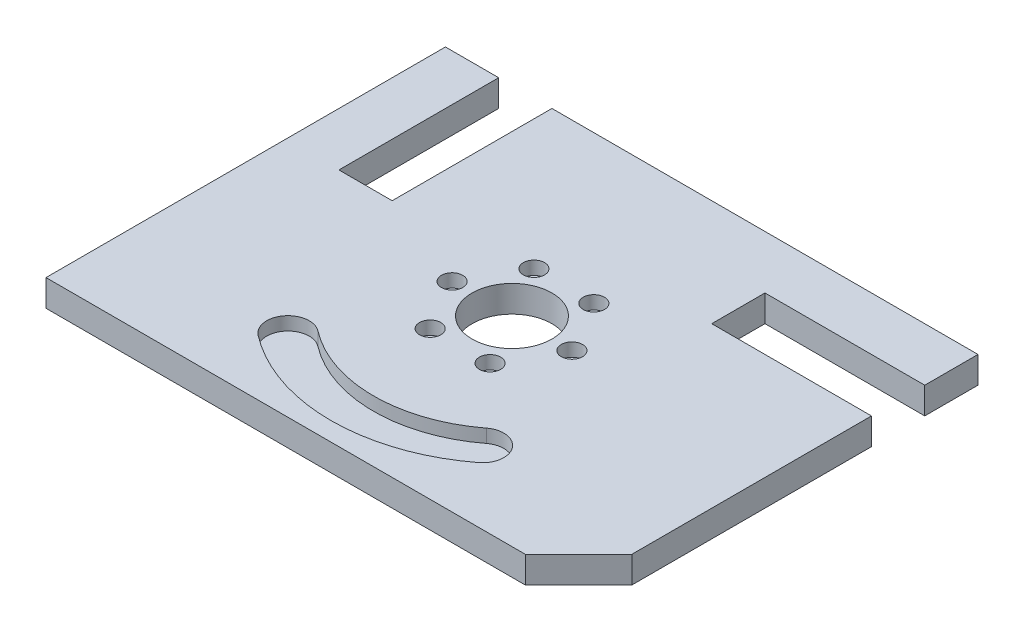
ISO-10303-21;
HEADER;
FILE_DESCRIPTION(('STEP AP214'),'2;1');
FILE_NAME('part.step','',(''),(''),'','','');
FILE_SCHEMA(('AUTOMOTIVE_DESIGN { 1 0 10303 214 1 1 1 1 }'));
ENDSEC;
DATA;
#1=APPLICATION_CONTEXT('core data for automotive mechanical design processes');
#2=APPLICATION_PROTOCOL_DEFINITION('international standard','automotive_design',2000,#1);
#3=PRODUCT_CONTEXT('',#1,'mechanical');
#4=PRODUCT('Part','Part','',(#3));
#5=PRODUCT_RELATED_PRODUCT_CATEGORY('part','',(#4));
#6=PRODUCT_DEFINITION_FORMATION('','',#4);
#7=PRODUCT_DEFINITION_CONTEXT('part definition',#1,'design');
#8=PRODUCT_DEFINITION('design','',#6,#7);
#9=PRODUCT_DEFINITION_SHAPE('','',#8);
#10=(LENGTH_UNIT() NAMED_UNIT(*) SI_UNIT(.MILLI.,.METRE.));
#11=(NAMED_UNIT(*) PLANE_ANGLE_UNIT() SI_UNIT($,.RADIAN.));
#12=(NAMED_UNIT(*) SI_UNIT($,.STERADIAN.) SOLID_ANGLE_UNIT());
#13=UNCERTAINTY_MEASURE_WITH_UNIT(LENGTH_MEASURE(1.E-05),#10,'distance_accuracy_value','');
#14=(GEOMETRIC_REPRESENTATION_CONTEXT(3) GLOBAL_UNCERTAINTY_ASSIGNED_CONTEXT((#13)) GLOBAL_UNIT_ASSIGNED_CONTEXT((#10,
#11,#12)) REPRESENTATION_CONTEXT('',''));
#15=CARTESIAN_POINT('',(0.,0.,0.));
#16=DIRECTION('',(0.,0.,1.));
#17=DIRECTION('',(1.,0.,0.));
#18=AXIS2_PLACEMENT_3D('',#15,#16,#17);
#19=CARTESIAN_POINT('',(100.,10.,-35.));
#20=DIRECTION('',(-1.,0.,0.));
#21=DIRECTION('',(0.,0.,1.));
#22=AXIS2_PLACEMENT_3D('',#19,#20,#21);
#23=PLANE('',#22);
#24=DIRECTION('',(0.,0.,-1.));
#25=VECTOR('',#24,1.);
#26=CARTESIAN_POINT('',(100.,10.,-35.));
#27=LINE('',#26,#25);
#28=CARTESIAN_POINT('',(100.,10.,55.));
#29=VERTEX_POINT('',#28);
#30=CARTESIAN_POINT('',(100.,10.,-35.));
#31=VERTEX_POINT('',#30);
#32=EDGE_CURVE('E266',#29,#31,#27,.T.);
#33=ORIENTED_EDGE('',*,*,#32,.F.);
#34=DIRECTION('',(0.,-1.,0.));
#35=VECTOR('',#34,1.);
#36=CARTESIAN_POINT('',(100.,10.,55.));
#37=LINE('',#36,#35);
#38=CARTESIAN_POINT('',(100.,0.,55.));
#39=VERTEX_POINT('',#38);
#40=EDGE_CURVE('E381',#29,#39,#37,.T.);
#41=ORIENTED_EDGE('',*,*,#40,.T.);
#42=DIRECTION('',(0.,0.,-1.));
#43=VECTOR('',#42,1.);
#44=CARTESIAN_POINT('',(100.,0.,-35.));
#45=LINE('',#44,#43);
#46=CARTESIAN_POINT('',(100.,0.,-35.));
#47=VERTEX_POINT('',#46);
#48=EDGE_CURVE('E262',#39,#47,#45,.T.);
#49=ORIENTED_EDGE('',*,*,#48,.T.);
#50=DIRECTION('',(0.,-1.,0.));
#51=VECTOR('',#50,1.);
#52=CARTESIAN_POINT('',(100.,10.,-35.));
#53=LINE('',#52,#51);
#54=EDGE_CURVE('E377',#31,#47,#53,.T.);
#55=ORIENTED_EDGE('',*,*,#54,.F.);
#56=EDGE_LOOP('',(#33,#41,#49,#55));
#57=FACE_BOUND('',#56,.T.);
#58=ADVANCED_FACE('F46',(#57),#23,.F.);
#59=CARTESIAN_POINT('',(40.,10.,-35.));
#60=DIRECTION('',(0.,0.,1.));
#61=DIRECTION('',(1.,0.,0.));
#62=AXIS2_PLACEMENT_3D('',#59,#60,#61);
#63=PLANE('',#62);
#64=DIRECTION('',(-1.,0.,0.));
#65=VECTOR('',#64,1.);
#66=CARTESIAN_POINT('',(40.,0.,-35.));
#67=LINE('',#66,#65);
#68=CARTESIAN_POINT('',(40.,0.,-35.));
#69=VERTEX_POINT('',#68);
#70=EDGE_CURVE('E306',#47,#69,#67,.T.);
#71=ORIENTED_EDGE('',*,*,#70,.T.);
#72=DIRECTION('',(0.,-1.,0.));
#73=VECTOR('',#72,1.);
#74=CARTESIAN_POINT('',(40.,10.,-35.));
#75=LINE('',#74,#73);
#76=CARTESIAN_POINT('',(40.,10.,-35.));
#77=VERTEX_POINT('',#76);
#78=EDGE_CURVE('E373',#77,#69,#75,.T.);
#79=ORIENTED_EDGE('',*,*,#78,.F.);
#80=DIRECTION('',(-1.,0.,0.));
#81=VECTOR('',#80,1.);
#82=CARTESIAN_POINT('',(40.,10.,-35.));
#83=LINE('',#82,#81);
#84=EDGE_CURVE('E269',#31,#77,#83,.T.);
#85=ORIENTED_EDGE('',*,*,#84,.F.);
#86=ORIENTED_EDGE('',*,*,#54,.T.);
#87=EDGE_LOOP('',(#71,#79,#85,#86));
#88=FACE_BOUND('',#87,.T.);
#89=ADVANCED_FACE('F428',(#88),#63,.F.);
#90=CARTESIAN_POINT('',(40.,10.,-55.));
#91=DIRECTION('',(-1.,0.,0.));
#92=DIRECTION('',(0.,0.,1.));
#93=AXIS2_PLACEMENT_3D('',#90,#91,#92);
#94=PLANE('',#93);
#95=DIRECTION('',(0.,0.,-1.));
#96=VECTOR('',#95,1.);
#97=CARTESIAN_POINT('',(40.,0.,-55.));
#98=LINE('',#97,#96);
#99=CARTESIAN_POINT('',(40.,0.,-55.));
#100=VERTEX_POINT('',#99);
#101=EDGE_CURVE('E309',#69,#100,#98,.T.);
#102=ORIENTED_EDGE('',*,*,#101,.T.);
#103=DIRECTION('',(0.,-1.,0.));
#104=VECTOR('',#103,1.);
#105=CARTESIAN_POINT('',(40.,10.,-55.));
#106=LINE('',#105,#104);
#107=CARTESIAN_POINT('',(40.,10.,-55.));
#108=VERTEX_POINT('',#107);
#109=EDGE_CURVE('E369',#108,#100,#106,.T.);
#110=ORIENTED_EDGE('',*,*,#109,.F.);
#111=DIRECTION('',(0.,0.,-1.));
#112=VECTOR('',#111,1.);
#113=CARTESIAN_POINT('',(40.,10.,-55.));
#114=LINE('',#113,#112);
#115=EDGE_CURVE('E273',#77,#108,#114,.T.);
#116=ORIENTED_EDGE('',*,*,#115,.F.);
#117=ORIENTED_EDGE('',*,*,#78,.T.);
#118=EDGE_LOOP('',(#102,#110,#116,#117));
#119=FACE_BOUND('',#118,.T.);
#120=ADVANCED_FACE('F434',(#119),#94,.F.);
#121=CARTESIAN_POINT('',(100.,10.,-55.));
#122=DIRECTION('',(0.,0.,-1.));
#123=DIRECTION('',(-1.,0.,0.));
#124=AXIS2_PLACEMENT_3D('',#121,#122,#123);
#125=PLANE('',#124);
#126=DIRECTION('',(1.,0.,0.));
#127=VECTOR('',#126,1.);
#128=CARTESIAN_POINT('',(100.,0.,-55.));
#129=LINE('',#128,#127);
#130=CARTESIAN_POINT('',(100.,0.,-55.));
#131=VERTEX_POINT('',#130);
#132=EDGE_CURVE('E312',#100,#131,#129,.T.);
#133=ORIENTED_EDGE('',*,*,#132,.T.);
#134=DIRECTION('',(0.,-1.,0.));
#135=VECTOR('',#134,1.);
#136=CARTESIAN_POINT('',(100.,10.,-55.));
#137=LINE('',#136,#135);
#138=CARTESIAN_POINT('',(100.,10.,-55.));
#139=VERTEX_POINT('',#138);
#140=EDGE_CURVE('E365',#139,#131,#137,.T.);
#141=ORIENTED_EDGE('',*,*,#140,.F.);
#142=DIRECTION('',(1.,0.,0.));
#143=VECTOR('',#142,1.);
#144=CARTESIAN_POINT('',(100.,10.,-55.));
#145=LINE('',#144,#143);
#146=EDGE_CURVE('E276',#108,#139,#145,.T.);
#147=ORIENTED_EDGE('',*,*,#146,.F.);
#148=ORIENTED_EDGE('',*,*,#109,.T.);
#149=EDGE_LOOP('',(#133,#141,#147,#148));
#150=FACE_BOUND('',#149,.T.);
#151=ADVANCED_FACE('F436',(#150),#125,.F.);
#152=CARTESIAN_POINT('',(100.,10.,-75.));
#153=DIRECTION('',(-1.,0.,0.));
#154=DIRECTION('',(0.,0.,1.));
#155=AXIS2_PLACEMENT_3D('',#152,#153,#154);
#156=PLANE('',#155);
#157=DIRECTION('',(0.,0.,-1.));
#158=VECTOR('',#157,1.);
#159=CARTESIAN_POINT('',(100.,0.,-75.));
#160=LINE('',#159,#158);
#161=CARTESIAN_POINT('',(100.,0.,-75.));
#162=VERTEX_POINT('',#161);
#163=EDGE_CURVE('E315',#131,#162,#160,.T.);
#164=ORIENTED_EDGE('',*,*,#163,.T.);
#165=DIRECTION('',(0.,-1.,0.));
#166=VECTOR('',#165,1.);
#167=CARTESIAN_POINT('',(100.,10.,-75.));
#168=LINE('',#167,#166);
#169=CARTESIAN_POINT('',(100.,10.,-75.));
#170=VERTEX_POINT('',#169);
#171=EDGE_CURVE('E361',#170,#162,#168,.T.);
#172=ORIENTED_EDGE('',*,*,#171,.F.);
#173=DIRECTION('',(0.,0.,-1.));
#174=VECTOR('',#173,1.);
#175=CARTESIAN_POINT('',(100.,10.,-75.));
#176=LINE('',#175,#174);
#177=EDGE_CURVE('E279',#139,#170,#176,.T.);
#178=ORIENTED_EDGE('',*,*,#177,.F.);
#179=ORIENTED_EDGE('',*,*,#140,.T.);
#180=EDGE_LOOP('',(#164,#172,#178,#179));
#181=FACE_BOUND('',#180,.T.);
#182=ADVANCED_FACE('F441',(#181),#156,.F.);
#183=CARTESIAN_POINT('',(-60.,10.,-75.));
#184=DIRECTION('',(0.,0.,1.));
#185=DIRECTION('',(1.,0.,0.));
#186=AXIS2_PLACEMENT_3D('',#183,#184,#185);
#187=PLANE('',#186);
#188=DIRECTION('',(-1.,0.,0.));
#189=VECTOR('',#188,1.);
#190=CARTESIAN_POINT('',(-60.,0.,-75.));
#191=LINE('',#190,#189);
#192=CARTESIAN_POINT('',(-60.,0.,-75.));
#193=VERTEX_POINT('',#192);
#194=EDGE_CURVE('E318',#162,#193,#191,.T.);
#195=ORIENTED_EDGE('',*,*,#194,.T.);
#196=DIRECTION('',(0.,-1.,0.));
#197=VECTOR('',#196,1.);
#198=CARTESIAN_POINT('',(-60.,10.,-75.));
#199=LINE('',#198,#197);
#200=CARTESIAN_POINT('',(-60.,10.,-75.));
#201=VERTEX_POINT('',#200);
#202=EDGE_CURVE('E357',#201,#193,#199,.T.);
#203=ORIENTED_EDGE('',*,*,#202,.F.);
#204=DIRECTION('',(-1.,0.,0.));
#205=VECTOR('',#204,1.);
#206=CARTESIAN_POINT('',(-60.,10.,-75.));
#207=LINE('',#206,#205);
#208=EDGE_CURVE('E282',#170,#201,#207,.T.);
#209=ORIENTED_EDGE('',*,*,#208,.F.);
#210=ORIENTED_EDGE('',*,*,#171,.T.);
#211=EDGE_LOOP('',(#195,#203,#209,#210));
#212=FACE_BOUND('',#211,.T.);
#213=ADVANCED_FACE('F447',(#212),#187,.F.);
#214=CARTESIAN_POINT('',(-60.,10.,-15.));
#215=DIRECTION('',(1.,0.,0.));
#216=DIRECTION('',(0.,0.,-1.));
#217=AXIS2_PLACEMENT_3D('',#214,#215,#216);
#218=PLANE('',#217);
#219=DIRECTION('',(0.,0.,1.));
#220=VECTOR('',#219,1.);
#221=CARTESIAN_POINT('',(-60.,0.,-15.));
#222=LINE('',#221,#220);
#223=CARTESIAN_POINT('',(-60.,0.,-15.));
#224=VERTEX_POINT('',#223);
#225=EDGE_CURVE('E321',#193,#224,#222,.T.);
#226=ORIENTED_EDGE('',*,*,#225,.T.);
#227=DIRECTION('',(0.,-1.,0.));
#228=VECTOR('',#227,1.);
#229=CARTESIAN_POINT('',(-60.,10.,-15.));
#230=LINE('',#229,#228);
#231=CARTESIAN_POINT('',(-60.,10.,-15.));
#232=VERTEX_POINT('',#231);
#233=EDGE_CURVE('E353',#232,#224,#230,.T.);
#234=ORIENTED_EDGE('',*,*,#233,.F.);
#235=DIRECTION('',(0.,0.,1.));
#236=VECTOR('',#235,1.);
#237=CARTESIAN_POINT('',(-60.,10.,-15.));
#238=LINE('',#237,#236);
#239=EDGE_CURVE('E285',#201,#232,#238,.T.);
#240=ORIENTED_EDGE('',*,*,#239,.F.);
#241=ORIENTED_EDGE('',*,*,#202,.T.);
#242=EDGE_LOOP('',(#226,#234,#240,#241));
#243=FACE_BOUND('',#242,.T.);
#244=ADVANCED_FACE('F451',(#243),#218,.F.);
#245=CARTESIAN_POINT('',(-80.,10.,-15.));
#246=DIRECTION('',(0.,0.,1.));
#247=DIRECTION('',(1.,0.,0.));
#248=AXIS2_PLACEMENT_3D('',#245,#246,#247);
#249=PLANE('',#248);
#250=DIRECTION('',(-1.,0.,0.));
#251=VECTOR('',#250,1.);
#252=CARTESIAN_POINT('',(-80.,0.,-15.));
#253=LINE('',#252,#251);
#254=CARTESIAN_POINT('',(-80.,0.,-15.));
#255=VERTEX_POINT('',#254);
#256=EDGE_CURVE('E324',#224,#255,#253,.T.);
#257=ORIENTED_EDGE('',*,*,#256,.T.);
#258=DIRECTION('',(0.,-1.,0.));
#259=VECTOR('',#258,1.);
#260=CARTESIAN_POINT('',(-80.,10.,-15.));
#261=LINE('',#260,#259);
#262=CARTESIAN_POINT('',(-80.,10.,-15.));
#263=VERTEX_POINT('',#262);
#264=EDGE_CURVE('E349',#263,#255,#261,.T.);
#265=ORIENTED_EDGE('',*,*,#264,.F.);
#266=DIRECTION('',(-1.,0.,0.));
#267=VECTOR('',#266,1.);
#268=CARTESIAN_POINT('',(-80.,10.,-15.));
#269=LINE('',#268,#267);
#270=EDGE_CURVE('E288',#232,#263,#269,.T.);
#271=ORIENTED_EDGE('',*,*,#270,.F.);
#272=ORIENTED_EDGE('',*,*,#233,.T.);
#273=EDGE_LOOP('',(#257,#265,#271,#272));
#274=FACE_BOUND('',#273,.T.);
#275=ADVANCED_FACE('F456',(#274),#249,.F.);
#276=CARTESIAN_POINT('',(-80.,10.,-75.));
#277=DIRECTION('',(-1.,0.,0.));
#278=DIRECTION('',(0.,0.,1.));
#279=AXIS2_PLACEMENT_3D('',#276,#277,#278);
#280=PLANE('',#279);
#281=DIRECTION('',(0.,0.,-1.));
#282=VECTOR('',#281,1.);
#283=CARTESIAN_POINT('',(-80.,0.,-75.));
#284=LINE('',#283,#282);
#285=CARTESIAN_POINT('',(-80.,0.,-75.));
#286=VERTEX_POINT('',#285);
#287=EDGE_CURVE('E327',#255,#286,#284,.T.);
#288=ORIENTED_EDGE('',*,*,#287,.T.);
#289=DIRECTION('',(0.,-1.,0.));
#290=VECTOR('',#289,1.);
#291=CARTESIAN_POINT('',(-80.,10.,-75.));
#292=LINE('',#291,#290);
#293=CARTESIAN_POINT('',(-80.,10.,-75.));
#294=VERTEX_POINT('',#293);
#295=EDGE_CURVE('E345',#294,#286,#292,.T.);
#296=ORIENTED_EDGE('',*,*,#295,.F.);
#297=DIRECTION('',(0.,0.,-1.));
#298=VECTOR('',#297,1.);
#299=CARTESIAN_POINT('',(-80.,10.,-75.));
#300=LINE('',#299,#298);
#301=EDGE_CURVE('E291',#263,#294,#300,.T.);
#302=ORIENTED_EDGE('',*,*,#301,.F.);
#303=ORIENTED_EDGE('',*,*,#264,.T.);
#304=EDGE_LOOP('',(#288,#296,#302,#303));
#305=FACE_BOUND('',#304,.T.);
#306=ADVANCED_FACE('F462',(#305),#280,.F.);
#307=CARTESIAN_POINT('',(-100.,10.,-75.));
#308=DIRECTION('',(0.,0.,1.));
#309=DIRECTION('',(1.,0.,0.));
#310=AXIS2_PLACEMENT_3D('',#307,#308,#309);
#311=PLANE('',#310);
#312=DIRECTION('',(-1.,0.,0.));
#313=VECTOR('',#312,1.);
#314=CARTESIAN_POINT('',(-100.,0.,-75.));
#315=LINE('',#314,#313);
#316=CARTESIAN_POINT('',(-100.,0.,-75.));
#317=VERTEX_POINT('',#316);
#318=EDGE_CURVE('E330',#286,#317,#315,.T.);
#319=ORIENTED_EDGE('',*,*,#318,.T.);
#320=DIRECTION('',(0.,-1.,0.));
#321=VECTOR('',#320,1.);
#322=CARTESIAN_POINT('',(-100.,10.,-75.));
#323=LINE('',#322,#321);
#324=CARTESIAN_POINT('',(-100.,10.,-75.));
#325=VERTEX_POINT('',#324);
#326=EDGE_CURVE('E341',#325,#317,#323,.T.);
#327=ORIENTED_EDGE('',*,*,#326,.F.);
#328=DIRECTION('',(-1.,0.,0.));
#329=VECTOR('',#328,1.);
#330=CARTESIAN_POINT('',(-100.,10.,-75.));
#331=LINE('',#330,#329);
#332=EDGE_CURVE('E294',#294,#325,#331,.T.);
#333=ORIENTED_EDGE('',*,*,#332,.F.);
#334=ORIENTED_EDGE('',*,*,#295,.T.);
#335=EDGE_LOOP('',(#319,#327,#333,#334));
#336=FACE_BOUND('',#335,.T.);
#337=ADVANCED_FACE('F466',(#336),#311,.F.);
#338=CARTESIAN_POINT('',(-100.,10.,-75.));
#339=DIRECTION('',(1.,0.,0.));
#340=DIRECTION('',(0.,0.,-1.));
#341=AXIS2_PLACEMENT_3D('',#338,#339,#340);
#342=PLANE('',#341);
#343=DIRECTION('',(0.,0.,1.));
#344=VECTOR('',#343,1.);
#345=CARTESIAN_POINT('',(-100.,0.,-75.));
#346=LINE('',#345,#344);
#347=CARTESIAN_POINT('',(-100.,0.,75.));
#348=VERTEX_POINT('',#347);
#349=EDGE_CURVE('E333',#317,#348,#346,.T.);
#350=ORIENTED_EDGE('',*,*,#349,.T.);
#351=DIRECTION('',(0.,-1.,0.));
#352=VECTOR('',#351,1.);
#353=CARTESIAN_POINT('',(-100.,10.,75.));
#354=LINE('',#353,#352);
#355=CARTESIAN_POINT('',(-100.,10.,75.));
#356=VERTEX_POINT('',#355);
#357=EDGE_CURVE('E303',#356,#348,#354,.T.);
#358=ORIENTED_EDGE('',*,*,#357,.F.);
#359=DIRECTION('',(0.,0.,1.));
#360=VECTOR('',#359,1.);
#361=CARTESIAN_POINT('',(-100.,10.,-75.));
#362=LINE('',#361,#360);
#363=EDGE_CURVE('E297',#325,#356,#362,.T.);
#364=ORIENTED_EDGE('',*,*,#363,.F.);
#365=ORIENTED_EDGE('',*,*,#326,.T.);
#366=EDGE_LOOP('',(#350,#358,#364,#365));
#367=FACE_BOUND('',#366,.T.);
#368=ADVANCED_FACE('F469',(#367),#342,.F.);
#369=CARTESIAN_POINT('',(-100.,10.,75.));
#370=DIRECTION('',(0.,0.,-1.));
#371=DIRECTION('',(-1.,0.,0.));
#372=AXIS2_PLACEMENT_3D('',#369,#370,#371);
#373=PLANE('',#372);
#374=DIRECTION('',(1.,0.,0.));
#375=VECTOR('',#374,1.);
#376=CARTESIAN_POINT('',(-100.,0.,75.));
#377=LINE('',#376,#375);
#378=CARTESIAN_POINT('',(79.9999999999999,0.,75.));
#379=VERTEX_POINT('',#378);
#380=EDGE_CURVE('E270',#348,#379,#377,.T.);
#381=ORIENTED_EDGE('',*,*,#380,.T.);
#382=DIRECTION('',(0.,1.,0.));
#383=VECTOR('',#382,1.);
#384=CARTESIAN_POINT('',(79.9999999999999,10.,75.));
#385=LINE('',#384,#383);
#386=CARTESIAN_POINT('',(79.9999999999999,10.,75.));
#387=VERTEX_POINT('',#386);
#388=EDGE_CURVE('E56',#379,#387,#385,.T.);
#389=ORIENTED_EDGE('',*,*,#388,.T.);
#390=DIRECTION('',(1.,0.,0.));
#391=VECTOR('',#390,1.);
#392=CARTESIAN_POINT('',(-100.,10.,75.));
#393=LINE('',#392,#391);
#394=EDGE_CURVE('E300',#356,#387,#393,.T.);
#395=ORIENTED_EDGE('',*,*,#394,.F.);
#396=ORIENTED_EDGE('',*,*,#357,.T.);
#397=EDGE_LOOP('',(#381,#389,#395,#396));
#398=FACE_BOUND('',#397,.T.);
#399=ADVANCED_FACE('F407',(#398),#373,.F.);
#400=CARTESIAN_POINT('',(0.,10.,0.));
#401=DIRECTION('',(0.,1.,0.));
#402=DIRECTION('',(0.,0.,1.));
#403=AXIS2_PLACEMENT_3D('',#400,#401,#402);
#404=PLANE('',#403);
#405=CARTESIAN_POINT('',(22.5,10.,0.));
#406=DIRECTION('',(0.,1.,0.));
#407=DIRECTION('',(0.,0.,1.));
#408=AXIS2_PLACEMENT_3D('',#405,#406,#407);
#409=CIRCLE('',#408,4.);
#410=CARTESIAN_POINT('',(22.5,10.,4.));
#411=VERTEX_POINT('',#410);
#412=EDGE_CURVE('E229',#411,#411,#409,.T.);
#413=ORIENTED_EDGE('',*,*,#412,.F.);
#414=EDGE_LOOP('',(#413));
#415=FACE_BOUND('',#414,.T.);
#416=CARTESIAN_POINT('',(11.25,10.,19.4855715851499));
#417=DIRECTION('',(0.,1.,0.));
#418=DIRECTION('',(0.,0.,1.));
#419=AXIS2_PLACEMENT_3D('',#416,#417,#418);
#420=CIRCLE('',#419,4.);
#421=CARTESIAN_POINT('',(11.25,10.,23.4855715851499));
#422=VERTEX_POINT('',#421);
#423=EDGE_CURVE('E237',#422,#422,#420,.T.);
#424=ORIENTED_EDGE('',*,*,#423,.F.);
#425=EDGE_LOOP('',(#424));
#426=FACE_BOUND('',#425,.T.);
#427=CARTESIAN_POINT('',(-11.2500000000001,10.,19.4855715851498));
#428=DIRECTION('',(0.,1.,0.));
#429=DIRECTION('',(0.,0.,1.));
#430=AXIS2_PLACEMENT_3D('',#427,#428,#429);
#431=CIRCLE('',#430,4.);
#432=CARTESIAN_POINT('',(-11.2500000000001,10.,23.4855715851498));
#433=VERTEX_POINT('',#432);
#434=EDGE_CURVE('E245',#433,#433,#431,.T.);
#435=ORIENTED_EDGE('',*,*,#434,.F.);
#436=EDGE_LOOP('',(#435));
#437=FACE_BOUND('',#436,.T.);
#438=CARTESIAN_POINT('',(-22.5,10.,-1.57116660247941E-13));
#439=DIRECTION('',(0.,1.,0.));
#440=DIRECTION('',(0.,0.,1.));
#441=AXIS2_PLACEMENT_3D('',#438,#439,#440);
#442=CIRCLE('',#441,4.);
#443=CARTESIAN_POINT('',(-22.5,10.,3.99999999999984));
#444=VERTEX_POINT('',#443);
#445=EDGE_CURVE('E253',#444,#444,#442,.T.);
#446=ORIENTED_EDGE('',*,*,#445,.F.);
#447=EDGE_LOOP('',(#446));
#448=FACE_BOUND('',#447,.T.);
#449=CARTESIAN_POINT('',(-11.2499999999998,10.,-19.48557158515));
#450=DIRECTION('',(0.,1.,0.));
#451=DIRECTION('',(0.,0.,1.));
#452=AXIS2_PLACEMENT_3D('',#449,#450,#451);
#453=CIRCLE('',#452,4.);
#454=CARTESIAN_POINT('',(-11.2499999999998,10.,-15.48557158515));
#455=VERTEX_POINT('',#454);
#456=EDGE_CURVE('E390',#455,#455,#453,.T.);
#457=ORIENTED_EDGE('',*,*,#456,.F.);
#458=EDGE_LOOP('',(#457));
#459=FACE_BOUND('',#458,.T.);
#460=CARTESIAN_POINT('',(11.2500000000002,10.,-19.4855715851497));
#461=DIRECTION('',(0.,1.,0.));
#462=DIRECTION('',(0.,0.,1.));
#463=AXIS2_PLACEMENT_3D('',#460,#461,#462);
#464=CIRCLE('',#463,4.);
#465=CARTESIAN_POINT('',(11.2500000000002,10.,-15.4855715851497));
#466=VERTEX_POINT('',#465);
#467=EDGE_CURVE('E201',#466,#466,#464,.T.);
#468=ORIENTED_EDGE('',*,*,#467,.F.);
#469=EDGE_LOOP('',(#468));
#470=FACE_BOUND('',#469,.T.);
#471=CARTESIAN_POINT('',(-36.5212503673279,10.,47.6046034707459));
#472=DIRECTION('',(0.,1.,0.));
#473=DIRECTION('',(0.,0.,1.));
#474=AXIS2_PLACEMENT_3D('',#471,#472,#473);
#475=CIRCLE('',#474,8.);
#476=CARTESIAN_POINT('',(-31.6517503183508,10.,41.2573230079798));
#477=VERTEX_POINT('',#476);
#478=CARTESIAN_POINT('',(-41.390750416305,10.,53.951883933512));
#479=VERTEX_POINT('',#478);
#480=EDGE_CURVE('E174',#477,#479,#475,.T.);
#481=ORIENTED_EDGE('',*,*,#480,.F.);
#482=CARTESIAN_POINT('',(0.,10.,0.));
#483=DIRECTION('',(0.,-1.,0.));
#484=DIRECTION('',(0.,0.,1.));
#485=AXIS2_PLACEMENT_3D('',#482,#483,#484);
#486=CIRCLE('',#485,52.);
#487=CARTESIAN_POINT('',(31.6517503183508,10.,41.2573230079798));
#488=VERTEX_POINT('',#487);
#489=EDGE_CURVE('E194',#488,#477,#486,.T.);
#490=ORIENTED_EDGE('',*,*,#489,.F.);
#491=CARTESIAN_POINT('',(36.5212503673279,10.,47.6046034707459));
#492=DIRECTION('',(0.,1.,0.));
#493=DIRECTION('',(0.,0.,1.));
#494=AXIS2_PLACEMENT_3D('',#491,#492,#493);
#495=CIRCLE('',#494,8.);
#496=CARTESIAN_POINT('',(41.390750416305,10.,53.951883933512));
#497=VERTEX_POINT('',#496);
#498=EDGE_CURVE('E198',#497,#488,#495,.T.);
#499=ORIENTED_EDGE('',*,*,#498,.F.);
#500=CARTESIAN_POINT('',(0.,10.,0.));
#501=DIRECTION('',(0.,1.,0.));
#502=DIRECTION('',(0.,0.,1.));
#503=AXIS2_PLACEMENT_3D('',#500,#501,#502);
#504=CIRCLE('',#503,68.);
#505=EDGE_CURVE('E210',#479,#497,#504,.T.);
#506=ORIENTED_EDGE('',*,*,#505,.F.);
#507=EDGE_LOOP('',(#481,#490,#499,#506));
#508=FACE_BOUND('',#507,.T.);
#509=CARTESIAN_POINT('',(0.,10.,0.));
#510=DIRECTION('',(0.,1.,0.));
#511=DIRECTION('',(0.,0.,1.));
#512=AXIS2_PLACEMENT_3D('',#509,#510,#511);
#513=CIRCLE('',#512,15.);
#514=CARTESIAN_POINT('',(0.,10.,15.));
#515=VERTEX_POINT('',#514);
#516=EDGE_CURVE('E228',#515,#515,#513,.T.);
#517=ORIENTED_EDGE('',*,*,#516,.F.);
#518=EDGE_LOOP('',(#517));
#519=FACE_BOUND('',#518,.T.);
#520=ORIENTED_EDGE('',*,*,#394,.T.);
#521=DIRECTION('',(-0.707106781186549,0.,0.707106781186546));
#522=VECTOR('',#521,1.);
#523=CARTESIAN_POINT('',(77.4999999999998,10.,77.5000000000001));
#524=LINE('',#523,#522);
#525=EDGE_CURVE('E11',#387,#29,#524,.F.);
#526=ORIENTED_EDGE('',*,*,#525,.T.);
#527=ORIENTED_EDGE('',*,*,#32,.T.);
#528=ORIENTED_EDGE('',*,*,#84,.T.);
#529=ORIENTED_EDGE('',*,*,#115,.T.);
#530=ORIENTED_EDGE('',*,*,#146,.T.);
#531=ORIENTED_EDGE('',*,*,#177,.T.);
#532=ORIENTED_EDGE('',*,*,#208,.T.);
#533=ORIENTED_EDGE('',*,*,#239,.T.);
#534=ORIENTED_EDGE('',*,*,#270,.T.);
#535=ORIENTED_EDGE('',*,*,#301,.T.);
#536=ORIENTED_EDGE('',*,*,#332,.T.);
#537=ORIENTED_EDGE('',*,*,#363,.T.);
#538=EDGE_LOOP('',(#520,#526,#527,#528,#529,#530,#531,#532,#533,#534,#535,#536,#537));
#539=FACE_BOUND('',#538,.T.);
#540=ADVANCED_FACE('F403',(#415,#426,#437,#448,#459,#470,#508,#519,#539),#404,.T.);
#541=CARTESIAN_POINT('',(0.,0.,0.));
#542=DIRECTION('',(0.,1.,0.));
#543=DIRECTION('',(0.,0.,1.));
#544=AXIS2_PLACEMENT_3D('',#541,#542,#543);
#545=PLANE('',#544);
#546=CARTESIAN_POINT('',(0.,0.,0.));
#547=DIRECTION('',(0.,1.,0.));
#548=DIRECTION('',(0.,0.,1.));
#549=AXIS2_PLACEMENT_3D('',#546,#547,#548);
#550=CIRCLE('',#549,15.);
#551=CARTESIAN_POINT('',(0.,0.,15.));
#552=VERTEX_POINT('',#551);
#553=EDGE_CURVE('E258',#552,#552,#550,.T.);
#554=ORIENTED_EDGE('',*,*,#553,.T.);
#555=EDGE_LOOP('',(#554));
#556=FACE_BOUND('',#555,.T.);
#557=ORIENTED_EDGE('',*,*,#48,.F.);
#558=DIRECTION('',(0.707106781186549,0.,-0.707106781186546));
#559=VECTOR('',#558,1.);
#560=CARTESIAN_POINT('',(100.,0.,55.));
#561=LINE('',#560,#559);
#562=EDGE_CURVE('E70',#39,#379,#561,.F.);
#563=ORIENTED_EDGE('',*,*,#562,.T.);
#564=ORIENTED_EDGE('',*,*,#380,.F.);
#565=ORIENTED_EDGE('',*,*,#349,.F.);
#566=ORIENTED_EDGE('',*,*,#318,.F.);
#567=ORIENTED_EDGE('',*,*,#287,.F.);
#568=ORIENTED_EDGE('',*,*,#256,.F.);
#569=ORIENTED_EDGE('',*,*,#225,.F.);
#570=ORIENTED_EDGE('',*,*,#194,.F.);
#571=ORIENTED_EDGE('',*,*,#163,.F.);
#572=ORIENTED_EDGE('',*,*,#132,.F.);
#573=ORIENTED_EDGE('',*,*,#101,.F.);
#574=ORIENTED_EDGE('',*,*,#70,.F.);
#575=EDGE_LOOP('',(#557,#563,#564,#565,#566,#567,#568,#569,#570,#571,#572,#573,#574));
#576=FACE_BOUND('',#575,.T.);
#577=ADVANCED_FACE('F406',(#556,#576),#545,.F.);
#578=CARTESIAN_POINT('',(0.,0.,0.));
#579=DIRECTION('',(0.,1.,0.));
#580=DIRECTION('',(0.,0.,1.));
#581=AXIS2_PLACEMENT_3D('',#578,#579,#580);
#582=CYLINDRICAL_SURFACE('',#581,15.);
#583=ORIENTED_EDGE('',*,*,#516,.T.);
#584=EDGE_LOOP('',(#583));
#585=FACE_BOUND('',#584,.T.);
#586=ORIENTED_EDGE('',*,*,#553,.F.);
#587=EDGE_LOOP('',(#586));
#588=FACE_BOUND('',#587,.T.);
#589=ADVANCED_FACE('F598',(#585,#588),#582,.F.);
#590=CARTESIAN_POINT('',(-36.5212503673279,5.,47.6046034707459));
#591=DIRECTION('',(0.,1.,0.));
#592=DIRECTION('',(0.,0.,1.));
#593=AXIS2_PLACEMENT_3D('',#590,#591,#592);
#594=CYLINDRICAL_SURFACE('',#593,8.);
#595=ORIENTED_EDGE('',*,*,#480,.T.);
#596=DIRECTION('',(0.,1.,0.));
#597=VECTOR('',#596,1.);
#598=CARTESIAN_POINT('',(-41.390750416305,5.,53.951883933512));
#599=LINE('',#598,#597);
#600=CARTESIAN_POINT('',(-41.390750416305,5.,53.951883933512));
#601=VERTEX_POINT('',#600);
#602=EDGE_CURVE('E167',#601,#479,#599,.T.);
#603=ORIENTED_EDGE('',*,*,#602,.F.);
#604=CARTESIAN_POINT('',(-36.5212503673279,5.,47.6046034707459));
#605=DIRECTION('',(0.,1.,0.));
#606=DIRECTION('',(0.,0.,1.));
#607=AXIS2_PLACEMENT_3D('',#604,#605,#606);
#608=CIRCLE('',#607,8.);
#609=CARTESIAN_POINT('',(-31.6517503183508,5.,41.2573230079798));
#610=VERTEX_POINT('',#609);
#611=EDGE_CURVE('E171',#610,#601,#608,.T.);
#612=ORIENTED_EDGE('',*,*,#611,.F.);
#613=DIRECTION('',(0.,1.,0.));
#614=VECTOR('',#613,1.);
#615=CARTESIAN_POINT('',(-31.6517503183508,5.,41.2573230079798));
#616=LINE('',#615,#614);
#617=EDGE_CURVE('E216',#610,#477,#616,.T.);
#618=ORIENTED_EDGE('',*,*,#617,.T.);
#619=EDGE_LOOP('',(#595,#603,#612,#618));
#620=FACE_BOUND('',#619,.T.);
#621=ADVANCED_FACE('F169',(#620),#594,.F.);
#622=CARTESIAN_POINT('',(0.,5.,0.));
#623=DIRECTION('',(0.,1.,0.));
#624=DIRECTION('',(0.,0.,1.));
#625=AXIS2_PLACEMENT_3D('',#622,#623,#624);
#626=CYLINDRICAL_SURFACE('',#625,52.);
#627=ORIENTED_EDGE('',*,*,#489,.T.);
#628=ORIENTED_EDGE('',*,*,#617,.F.);
#629=CARTESIAN_POINT('',(0.,5.,0.));
#630=DIRECTION('',(0.,-1.,0.));
#631=DIRECTION('',(0.,0.,1.));
#632=AXIS2_PLACEMENT_3D('',#629,#630,#631);
#633=CIRCLE('',#632,52.);
#634=CARTESIAN_POINT('',(31.6517503183508,5.,41.2573230079798));
#635=VERTEX_POINT('',#634);
#636=EDGE_CURVE('E180',#635,#610,#633,.T.);
#637=ORIENTED_EDGE('',*,*,#636,.F.);
#638=DIRECTION('',(0.,1.,0.));
#639=VECTOR('',#638,1.);
#640=CARTESIAN_POINT('',(31.6517503183508,5.,41.2573230079798));
#641=LINE('',#640,#639);
#642=EDGE_CURVE('E219',#635,#488,#641,.T.);
#643=ORIENTED_EDGE('',*,*,#642,.T.);
#644=EDGE_LOOP('',(#627,#628,#637,#643));
#645=FACE_BOUND('',#644,.T.);
#646=ADVANCED_FACE('F620',(#645),#626,.T.);
#647=CARTESIAN_POINT('',(36.5212503673279,5.,47.6046034707459));
#648=DIRECTION('',(0.,1.,0.));
#649=DIRECTION('',(0.,0.,1.));
#650=AXIS2_PLACEMENT_3D('',#647,#648,#649);
#651=CYLINDRICAL_SURFACE('',#650,8.);
#652=ORIENTED_EDGE('',*,*,#498,.T.);
#653=ORIENTED_EDGE('',*,*,#642,.F.);
#654=CARTESIAN_POINT('',(36.5212503673279,5.,47.6046034707459));
#655=DIRECTION('',(0.,1.,0.));
#656=DIRECTION('',(0.,0.,1.));
#657=AXIS2_PLACEMENT_3D('',#654,#655,#656);
#658=CIRCLE('',#657,8.);
#659=CARTESIAN_POINT('',(41.390750416305,5.,53.951883933512));
#660=VERTEX_POINT('',#659);
#661=EDGE_CURVE('E189',#660,#635,#658,.T.);
#662=ORIENTED_EDGE('',*,*,#661,.F.);
#663=DIRECTION('',(0.,1.,0.));
#664=VECTOR('',#663,1.);
#665=CARTESIAN_POINT('',(41.390750416305,5.,53.951883933512));
#666=LINE('',#665,#664);
#667=EDGE_CURVE('E179',#660,#497,#666,.T.);
#668=ORIENTED_EDGE('',*,*,#667,.T.);
#669=EDGE_LOOP('',(#652,#653,#662,#668));
#670=FACE_BOUND('',#669,.T.);
#671=ADVANCED_FACE('F631',(#670),#651,.F.);
#672=CARTESIAN_POINT('',(0.,5.,0.));
#673=DIRECTION('',(0.,1.,0.));
#674=DIRECTION('',(0.,0.,1.));
#675=AXIS2_PLACEMENT_3D('',#672,#673,#674);
#676=CYLINDRICAL_SURFACE('',#675,68.);
#677=ORIENTED_EDGE('',*,*,#505,.T.);
#678=ORIENTED_EDGE('',*,*,#667,.F.);
#679=CARTESIAN_POINT('',(0.,5.,0.));
#680=DIRECTION('',(0.,1.,0.));
#681=DIRECTION('',(0.,0.,1.));
#682=AXIS2_PLACEMENT_3D('',#679,#680,#681);
#683=CIRCLE('',#682,68.);
#684=EDGE_CURVE('E183',#601,#660,#683,.T.);
#685=ORIENTED_EDGE('',*,*,#684,.F.);
#686=ORIENTED_EDGE('',*,*,#602,.T.);
#687=EDGE_LOOP('',(#677,#678,#685,#686));
#688=FACE_BOUND('',#687,.T.);
#689=ADVANCED_FACE('F184',(#688),#676,.F.);
#690=CARTESIAN_POINT('',(-18.2606251836639,5.,23.8023017353729));
#691=DIRECTION('',(0.,1.,0.));
#692=DIRECTION('',(0.,0.,1.));
#693=AXIS2_PLACEMENT_3D('',#690,#691,#692);
#694=PLANE('',#693);
#695=ORIENTED_EDGE('',*,*,#611,.T.);
#696=ORIENTED_EDGE('',*,*,#684,.T.);
#697=ORIENTED_EDGE('',*,*,#661,.T.);
#698=ORIENTED_EDGE('',*,*,#636,.T.);
#699=EDGE_LOOP('',(#695,#696,#697,#698));
#700=FACE_BOUND('',#699,.T.);
#701=ADVANCED_FACE('F191',(#700),#694,.T.);
#702=CARTESIAN_POINT('',(11.2500000000002,5.,-19.4855715851497));
#703=DIRECTION('',(0.,1.,0.));
#704=DIRECTION('',(0.,0.,1.));
#705=AXIS2_PLACEMENT_3D('',#702,#703,#704);
#706=CYLINDRICAL_SURFACE('',#705,4.);
#707=CARTESIAN_POINT('',(11.2500000000002,5.,-19.4855715851497));
#708=DIRECTION('',(0.,1.,0.));
#709=DIRECTION('',(0.,0.,1.));
#710=AXIS2_PLACEMENT_3D('',#707,#708,#709);
#711=CIRCLE('',#710,4.);
#712=CARTESIAN_POINT('',(11.2500000000002,5.,-15.4855715851497));
#713=VERTEX_POINT('',#712);
#714=EDGE_CURVE('E394',#713,#713,#711,.T.);
#715=ORIENTED_EDGE('',*,*,#714,.F.);
#716=EDGE_LOOP('',(#715));
#717=FACE_BOUND('',#716,.T.);
#718=ORIENTED_EDGE('',*,*,#467,.T.);
#719=EDGE_LOOP('',(#718));
#720=FACE_BOUND('',#719,.T.);
#721=ADVANCED_FACE('F401',(#717,#720),#706,.F.);
#722=CARTESIAN_POINT('',(11.2500000000002,5.,-19.4855715851497));
#723=DIRECTION('',(0.,1.,0.));
#724=DIRECTION('',(0.,0.,1.));
#725=AXIS2_PLACEMENT_3D('',#722,#723,#724);
#726=PLANE('',#725);
#727=ORIENTED_EDGE('',*,*,#714,.T.);
#728=EDGE_LOOP('',(#727));
#729=FACE_BOUND('',#728,.T.);
#730=ADVANCED_FACE('F674',(#729),#726,.T.);
#731=CARTESIAN_POINT('',(-11.2499999999998,5.,-19.48557158515));
#732=DIRECTION('',(0.,1.,0.));
#733=DIRECTION('',(0.,0.,1.));
#734=AXIS2_PLACEMENT_3D('',#731,#732,#733);
#735=CYLINDRICAL_SURFACE('',#734,4.);
#736=CARTESIAN_POINT('',(-11.2499999999998,5.,-19.48557158515));
#737=DIRECTION('',(0.,1.,0.));
#738=DIRECTION('',(0.,0.,1.));
#739=AXIS2_PLACEMENT_3D('',#736,#737,#738);
#740=CIRCLE('',#739,4.);
#741=CARTESIAN_POINT('',(-11.2499999999998,5.,-15.48557158515));
#742=VERTEX_POINT('',#741);
#743=EDGE_CURVE('E257',#742,#742,#740,.T.);
#744=ORIENTED_EDGE('',*,*,#743,.F.);
#745=EDGE_LOOP('',(#744));
#746=FACE_BOUND('',#745,.T.);
#747=ORIENTED_EDGE('',*,*,#456,.T.);
#748=EDGE_LOOP('',(#747));
#749=FACE_BOUND('',#748,.T.);
#750=ADVANCED_FACE('F686',(#746,#749),#735,.F.);
#751=CARTESIAN_POINT('',(-11.2499999999998,5.,-19.48557158515));
#752=DIRECTION('',(0.,1.,0.));
#753=DIRECTION('',(0.,0.,1.));
#754=AXIS2_PLACEMENT_3D('',#751,#752,#753);
#755=PLANE('',#754);
#756=ORIENTED_EDGE('',*,*,#743,.T.);
#757=EDGE_LOOP('',(#756));
#758=FACE_BOUND('',#757,.T.);
#759=ADVANCED_FACE('F698',(#758),#755,.T.);
#760=CARTESIAN_POINT('',(-22.5,5.,-1.57116660247941E-13));
#761=DIRECTION('',(0.,1.,0.));
#762=DIRECTION('',(0.,0.,1.));
#763=AXIS2_PLACEMENT_3D('',#760,#761,#762);
#764=CYLINDRICAL_SURFACE('',#763,4.);
#765=CARTESIAN_POINT('',(-22.5,5.,-1.57116660247941E-13));
#766=DIRECTION('',(0.,1.,0.));
#767=DIRECTION('',(0.,0.,1.));
#768=AXIS2_PLACEMENT_3D('',#765,#766,#767);
#769=CIRCLE('',#768,4.);
#770=CARTESIAN_POINT('',(-22.5,5.,3.99999999999984));
#771=VERTEX_POINT('',#770);
#772=EDGE_CURVE('E249',#771,#771,#769,.T.);
#773=ORIENTED_EDGE('',*,*,#772,.F.);
#774=EDGE_LOOP('',(#773));
#775=FACE_BOUND('',#774,.T.);
#776=ORIENTED_EDGE('',*,*,#445,.T.);
#777=EDGE_LOOP('',(#776));
#778=FACE_BOUND('',#777,.T.);
#779=ADVANCED_FACE('F710',(#775,#778),#764,.F.);
#780=CARTESIAN_POINT('',(-22.5,5.,-1.57116660247941E-13));
#781=DIRECTION('',(0.,1.,0.));
#782=DIRECTION('',(0.,0.,1.));
#783=AXIS2_PLACEMENT_3D('',#780,#781,#782);
#784=PLANE('',#783);
#785=ORIENTED_EDGE('',*,*,#772,.T.);
#786=EDGE_LOOP('',(#785));
#787=FACE_BOUND('',#786,.T.);
#788=ADVANCED_FACE('F722',(#787),#784,.T.);
#789=CARTESIAN_POINT('',(-11.2500000000001,5.,19.4855715851498));
#790=DIRECTION('',(0.,1.,0.));
#791=DIRECTION('',(0.,0.,1.));
#792=AXIS2_PLACEMENT_3D('',#789,#790,#791);
#793=CYLINDRICAL_SURFACE('',#792,4.);
#794=CARTESIAN_POINT('',(-11.2500000000001,5.,19.4855715851498));
#795=DIRECTION('',(0.,1.,0.));
#796=DIRECTION('',(0.,0.,1.));
#797=AXIS2_PLACEMENT_3D('',#794,#795,#796);
#798=CIRCLE('',#797,4.);
#799=CARTESIAN_POINT('',(-11.2500000000001,5.,23.4855715851498));
#800=VERTEX_POINT('',#799);
#801=EDGE_CURVE('E241',#800,#800,#798,.T.);
#802=ORIENTED_EDGE('',*,*,#801,.F.);
#803=EDGE_LOOP('',(#802));
#804=FACE_BOUND('',#803,.T.);
#805=ORIENTED_EDGE('',*,*,#434,.T.);
#806=EDGE_LOOP('',(#805));
#807=FACE_BOUND('',#806,.T.);
#808=ADVANCED_FACE('F734',(#804,#807),#793,.F.);
#809=CARTESIAN_POINT('',(-11.2500000000001,5.,19.4855715851498));
#810=DIRECTION('',(0.,1.,0.));
#811=DIRECTION('',(0.,0.,1.));
#812=AXIS2_PLACEMENT_3D('',#809,#810,#811);
#813=PLANE('',#812);
#814=ORIENTED_EDGE('',*,*,#801,.T.);
#815=EDGE_LOOP('',(#814));
#816=FACE_BOUND('',#815,.T.);
#817=ADVANCED_FACE('F746',(#816),#813,.T.);
#818=CARTESIAN_POINT('',(11.25,5.,19.4855715851499));
#819=DIRECTION('',(0.,1.,0.));
#820=DIRECTION('',(0.,0.,1.));
#821=AXIS2_PLACEMENT_3D('',#818,#819,#820);
#822=CYLINDRICAL_SURFACE('',#821,4.);
#823=CARTESIAN_POINT('',(11.25,5.,19.4855715851499));
#824=DIRECTION('',(0.,1.,0.));
#825=DIRECTION('',(0.,0.,1.));
#826=AXIS2_PLACEMENT_3D('',#823,#824,#825);
#827=CIRCLE('',#826,4.);
#828=CARTESIAN_POINT('',(11.25,5.,23.4855715851499));
#829=VERTEX_POINT('',#828);
#830=EDGE_CURVE('E233',#829,#829,#827,.T.);
#831=ORIENTED_EDGE('',*,*,#830,.F.);
#832=EDGE_LOOP('',(#831));
#833=FACE_BOUND('',#832,.T.);
#834=ORIENTED_EDGE('',*,*,#423,.T.);
#835=EDGE_LOOP('',(#834));
#836=FACE_BOUND('',#835,.T.);
#837=ADVANCED_FACE('F758',(#833,#836),#822,.F.);
#838=CARTESIAN_POINT('',(11.25,5.,19.4855715851499));
#839=DIRECTION('',(0.,1.,0.));
#840=DIRECTION('',(0.,0.,1.));
#841=AXIS2_PLACEMENT_3D('',#838,#839,#840);
#842=PLANE('',#841);
#843=ORIENTED_EDGE('',*,*,#830,.T.);
#844=EDGE_LOOP('',(#843));
#845=FACE_BOUND('',#844,.T.);
#846=ADVANCED_FACE('F770',(#845),#842,.T.);
#847=CARTESIAN_POINT('',(22.5,5.,0.));
#848=DIRECTION('',(0.,1.,0.));
#849=DIRECTION('',(0.,0.,1.));
#850=AXIS2_PLACEMENT_3D('',#847,#848,#849);
#851=CYLINDRICAL_SURFACE('',#850,4.);
#852=CARTESIAN_POINT('',(22.5,5.,0.));
#853=DIRECTION('',(0.,1.,0.));
#854=DIRECTION('',(0.,0.,1.));
#855=AXIS2_PLACEMENT_3D('',#852,#853,#854);
#856=CIRCLE('',#855,4.);
#857=CARTESIAN_POINT('',(22.5,5.,4.));
#858=VERTEX_POINT('',#857);
#859=EDGE_CURVE('E224',#858,#858,#856,.T.);
#860=ORIENTED_EDGE('',*,*,#859,.F.);
#861=EDGE_LOOP('',(#860));
#862=FACE_BOUND('',#861,.T.);
#863=ORIENTED_EDGE('',*,*,#412,.T.);
#864=EDGE_LOOP('',(#863));
#865=FACE_BOUND('',#864,.T.);
#866=ADVANCED_FACE('F782',(#862,#865),#851,.F.);
#867=CARTESIAN_POINT('',(22.5,5.,0.));
#868=DIRECTION('',(0.,1.,0.));
#869=DIRECTION('',(0.,0.,1.));
#870=AXIS2_PLACEMENT_3D('',#867,#868,#869);
#871=PLANE('',#870);
#872=ORIENTED_EDGE('',*,*,#859,.T.);
#873=EDGE_LOOP('',(#872));
#874=FACE_BOUND('',#873,.T.);
#875=ADVANCED_FACE('F794',(#874),#871,.T.);
#876=CARTESIAN_POINT('',(100.,10.,55.));
#877=DIRECTION('',(-0.707106781186546,0.,-0.707106781186549));
#878=DIRECTION('',(0.,-1.,0.));
#879=AXIS2_PLACEMENT_3D('',#876,#877,#878);
#880=PLANE('',#879);
#881=ORIENTED_EDGE('',*,*,#525,.F.);
#882=ORIENTED_EDGE('',*,*,#388,.F.);
#883=ORIENTED_EDGE('',*,*,#562,.F.);
#884=ORIENTED_EDGE('',*,*,#40,.F.);
#885=EDGE_LOOP('',(#881,#882,#883,#884));
#886=FACE_BOUND('',#885,.T.);
#887=ADVANCED_FACE('F49',(#886),#880,.F.);
#888=CLOSED_SHELL('',(#58,#89,#120,#151,#182,#213,#244,#275,#306,#337,#368,#399,#540,#577,#589,
#621,#646,#671,#689,#701,#721,#730,#750,#759,#779,#788,#808,#817,#837,#846,#866,#875,#887));
#889=MANIFOLD_SOLID_BREP('B2',#888);
#890=ADVANCED_BREP_SHAPE_REPRESENTATION('',(#18,#889),#14);
#891=SHAPE_DEFINITION_REPRESENTATION(#9,#890);
ENDSEC;
END-ISO-10303-21;
